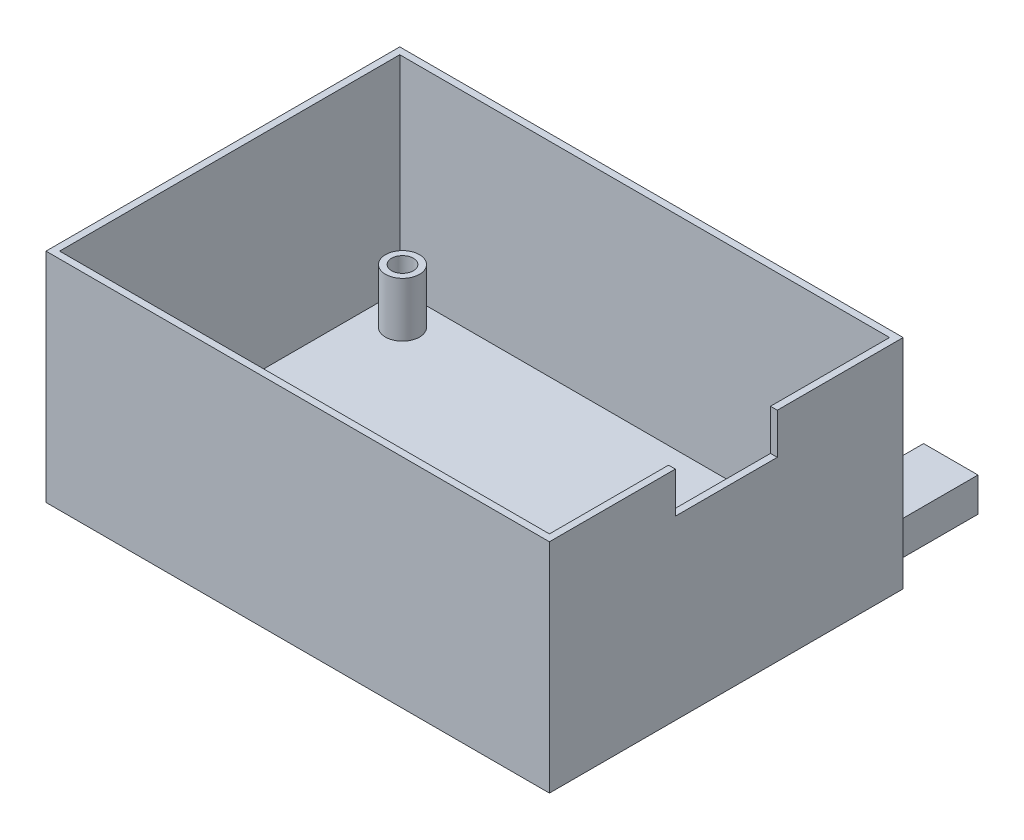
ISO-10303-21;
HEADER;
FILE_DESCRIPTION(('STEP AP214'),'2;1');
FILE_NAME('part.step','',(''),(''),'','','');
FILE_SCHEMA(('AUTOMOTIVE_DESIGN { 1 0 10303 214 1 1 1 1 }'));
ENDSEC;
DATA;
#1=APPLICATION_CONTEXT('core data for automotive mechanical design processes');
#2=APPLICATION_PROTOCOL_DEFINITION('international standard','automotive_design',2000,#1);
#3=PRODUCT_CONTEXT('',#1,'mechanical');
#4=PRODUCT('Part','Part','',(#3));
#5=PRODUCT_RELATED_PRODUCT_CATEGORY('part','',(#4));
#6=PRODUCT_DEFINITION_FORMATION('','',#4);
#7=PRODUCT_DEFINITION_CONTEXT('part definition',#1,'design');
#8=PRODUCT_DEFINITION('design','',#6,#7);
#9=PRODUCT_DEFINITION_SHAPE('','',#8);
#10=(LENGTH_UNIT() NAMED_UNIT(*) SI_UNIT(.MILLI.,.METRE.));
#11=(NAMED_UNIT(*) PLANE_ANGLE_UNIT() SI_UNIT($,.RADIAN.));
#12=(NAMED_UNIT(*) SI_UNIT($,.STERADIAN.) SOLID_ANGLE_UNIT());
#13=UNCERTAINTY_MEASURE_WITH_UNIT(LENGTH_MEASURE(1.E-05),#10,'distance_accuracy_value','');
#14=(GEOMETRIC_REPRESENTATION_CONTEXT(3) GLOBAL_UNCERTAINTY_ASSIGNED_CONTEXT((#13)) GLOBAL_UNIT_ASSIGNED_CONTEXT((#10,
#11,#12)) REPRESENTATION_CONTEXT('',''));
#15=CARTESIAN_POINT('',(0.,0.,0.));
#16=DIRECTION('',(0.,0.,1.));
#17=DIRECTION('',(1.,0.,0.));
#18=AXIS2_PLACEMENT_3D('',#15,#16,#17);
#19=CARTESIAN_POINT('',(37.,32.,-26.));
#20=DIRECTION('',(0.,0.,1.));
#21=DIRECTION('',(1.,0.,0.));
#22=AXIS2_PLACEMENT_3D('',#19,#20,#21);
#23=PLANE('',#22);
#24=DIRECTION('',(0.,1.,0.));
#25=VECTOR('',#24,1.);
#26=CARTESIAN_POINT('',(-33.,5.,-26.));
#27=LINE('',#26,#25);
#28=CARTESIAN_POINT('',(-33.,0.,-26.));
#29=VERTEX_POINT('',#28);
#30=CARTESIAN_POINT('',(-33.,5.,-26.));
#31=VERTEX_POINT('',#30);
#32=EDGE_CURVE('E223',#29,#31,#27,.T.);
#33=ORIENTED_EDGE('',*,*,#32,.F.);
#34=DIRECTION('',(-1.,0.,0.));
#35=VECTOR('',#34,1.);
#36=CARTESIAN_POINT('',(37.,0.,-26.));
#37=LINE('',#36,#35);
#38=CARTESIAN_POINT('',(-37.,0.,-26.));
#39=VERTEX_POINT('',#38);
#40=EDGE_CURVE('E490',#29,#39,#37,.T.);
#41=ORIENTED_EDGE('',*,*,#40,.T.);
#42=DIRECTION('',(0.,-1.,0.));
#43=VECTOR('',#42,1.);
#44=CARTESIAN_POINT('',(-37.,32.,-26.));
#45=LINE('',#44,#43);
#46=CARTESIAN_POINT('',(-37.,32.,-26.));
#47=VERTEX_POINT('',#46);
#48=EDGE_CURVE('E480',#47,#39,#45,.T.);
#49=ORIENTED_EDGE('',*,*,#48,.F.);
#50=DIRECTION('',(-1.,0.,0.));
#51=VECTOR('',#50,1.);
#52=CARTESIAN_POINT('',(37.,32.,-26.));
#53=LINE('',#52,#51);
#54=CARTESIAN_POINT('',(37.,32.,-26.));
#55=VERTEX_POINT('',#54);
#56=EDGE_CURVE('E477',#55,#47,#53,.T.);
#57=ORIENTED_EDGE('',*,*,#56,.F.);
#58=DIRECTION('',(0.,-1.,0.));
#59=VECTOR('',#58,1.);
#60=CARTESIAN_POINT('',(37.,32.,-26.));
#61=LINE('',#60,#59);
#62=CARTESIAN_POINT('',(37.,0.,-26.));
#63=VERTEX_POINT('',#62);
#64=EDGE_CURVE('E497',#55,#63,#61,.T.);
#65=ORIENTED_EDGE('',*,*,#64,.T.);
#66=CARTESIAN_POINT('',(33.,0.,-26.));
#67=VERTEX_POINT('',#66);
#68=EDGE_CURVE('E469',#63,#67,#37,.T.);
#69=ORIENTED_EDGE('',*,*,#68,.T.);
#70=DIRECTION('',(0.,-1.,0.));
#71=VECTOR('',#70,1.);
#72=CARTESIAN_POINT('',(33.,5.,-26.));
#73=LINE('',#72,#71);
#74=CARTESIAN_POINT('',(33.,5.,-26.));
#75=VERTEX_POINT('',#74);
#76=EDGE_CURVE('E241',#75,#67,#73,.T.);
#77=ORIENTED_EDGE('',*,*,#76,.F.);
#78=DIRECTION('',(1.,0.,0.));
#79=VECTOR('',#78,1.);
#80=CARTESIAN_POINT('',(33.,5.,-26.));
#81=LINE('',#80,#79);
#82=CARTESIAN_POINT('',(25.,5.,-26.));
#83=VERTEX_POINT('',#82);
#84=EDGE_CURVE('E230',#83,#75,#81,.T.);
#85=ORIENTED_EDGE('',*,*,#84,.F.);
#86=DIRECTION('',(0.,1.,0.));
#87=VECTOR('',#86,1.);
#88=CARTESIAN_POINT('',(25.,5.,-26.));
#89=LINE('',#88,#87);
#90=CARTESIAN_POINT('',(25.,0.,-26.));
#91=VERTEX_POINT('',#90);
#92=EDGE_CURVE('E225',#91,#83,#89,.T.);
#93=ORIENTED_EDGE('',*,*,#92,.F.);
#94=CARTESIAN_POINT('',(-25.,0.,-26.));
#95=VERTEX_POINT('',#94);
#96=EDGE_CURVE('E493',#91,#95,#37,.T.);
#97=ORIENTED_EDGE('',*,*,#96,.T.);
#98=DIRECTION('',(0.,-1.,0.));
#99=VECTOR('',#98,1.);
#100=CARTESIAN_POINT('',(-25.,5.,-26.));
#101=LINE('',#100,#99);
#102=CARTESIAN_POINT('',(-25.,5.,-26.));
#103=VERTEX_POINT('',#102);
#104=EDGE_CURVE('E60',#103,#95,#101,.T.);
#105=ORIENTED_EDGE('',*,*,#104,.F.);
#106=DIRECTION('',(1.,0.,0.));
#107=VECTOR('',#106,1.);
#108=CARTESIAN_POINT('',(-25.,5.,-26.));
#109=LINE('',#108,#107);
#110=EDGE_CURVE('E55',#31,#103,#109,.T.);
#111=ORIENTED_EDGE('',*,*,#110,.F.);
#112=EDGE_LOOP('',(#33,#41,#49,#57,#65,#69,#77,#85,#93,#97,#105,#111));
#113=FACE_BOUND('',#112,.T.);
#114=ADVANCED_FACE('F39',(#113),#23,.F.);
#115=CARTESIAN_POINT('',(-37.,32.,-26.));
#116=DIRECTION('',(1.,0.,0.));
#117=DIRECTION('',(0.,0.,-1.));
#118=AXIS2_PLACEMENT_3D('',#115,#116,#117);
#119=PLANE('',#118);
#120=DIRECTION('',(0.,0.,1.));
#121=VECTOR('',#120,1.);
#122=CARTESIAN_POINT('',(-37.,0.,-26.));
#123=LINE('',#122,#121);
#124=CARTESIAN_POINT('',(-37.,0.,26.));
#125=VERTEX_POINT('',#124);
#126=EDGE_CURVE('E454',#39,#125,#123,.T.);
#127=ORIENTED_EDGE('',*,*,#126,.T.);
#128=DIRECTION('',(0.,-1.,0.));
#129=VECTOR('',#128,1.);
#130=CARTESIAN_POINT('',(-37.,32.,26.));
#131=LINE('',#130,#129);
#132=CARTESIAN_POINT('',(-37.,32.,26.));
#133=VERTEX_POINT('',#132);
#134=EDGE_CURVE('E11',#133,#125,#131,.T.);
#135=ORIENTED_EDGE('',*,*,#134,.F.);
#136=DIRECTION('',(0.,0.,1.));
#137=VECTOR('',#136,1.);
#138=CARTESIAN_POINT('',(-37.,32.,-26.));
#139=LINE('',#138,#137);
#140=EDGE_CURVE('E464',#47,#133,#139,.T.);
#141=ORIENTED_EDGE('',*,*,#140,.F.);
#142=ORIENTED_EDGE('',*,*,#48,.T.);
#143=EDGE_LOOP('',(#127,#135,#141,#142));
#144=FACE_BOUND('',#143,.T.);
#145=ADVANCED_FACE('F41',(#144),#119,.F.);
#146=CARTESIAN_POINT('',(37.,32.,26.));
#147=DIRECTION('',(0.,0.,-1.));
#148=DIRECTION('',(-1.,0.,0.));
#149=AXIS2_PLACEMENT_3D('',#146,#147,#148);
#150=PLANE('',#149);
#151=DIRECTION('',(1.,0.,0.));
#152=VECTOR('',#151,1.);
#153=CARTESIAN_POINT('',(37.,0.,26.));
#154=LINE('',#153,#152);
#155=CARTESIAN_POINT('',(37.,0.,26.));
#156=VERTEX_POINT('',#155);
#157=EDGE_CURVE('E484',#125,#156,#154,.T.);
#158=ORIENTED_EDGE('',*,*,#157,.T.);
#159=DIRECTION('',(0.,-1.,0.));
#160=VECTOR('',#159,1.);
#161=CARTESIAN_POINT('',(37.,32.,26.));
#162=LINE('',#161,#160);
#163=CARTESIAN_POINT('',(37.,32.,26.));
#164=VERTEX_POINT('',#163);
#165=EDGE_CURVE('E48',#164,#156,#162,.T.);
#166=ORIENTED_EDGE('',*,*,#165,.F.);
#167=DIRECTION('',(1.,0.,0.));
#168=VECTOR('',#167,1.);
#169=CARTESIAN_POINT('',(37.,32.,26.));
#170=LINE('',#169,#168);
#171=EDGE_CURVE('E468',#133,#164,#170,.T.);
#172=ORIENTED_EDGE('',*,*,#171,.F.);
#173=ORIENTED_EDGE('',*,*,#134,.T.);
#174=EDGE_LOOP('',(#158,#166,#172,#173));
#175=FACE_BOUND('',#174,.T.);
#176=ADVANCED_FACE('F546',(#175),#150,.F.);
#177=CARTESIAN_POINT('',(37.,32.,-26.));
#178=DIRECTION('',(-1.,0.,0.));
#179=DIRECTION('',(0.,0.,1.));
#180=AXIS2_PLACEMENT_3D('',#177,#178,#179);
#181=PLANE('',#180);
#182=DIRECTION('',(0.,0.,1.));
#183=VECTOR('',#182,1.);
#184=CARTESIAN_POINT('',(37.,26.,-26.));
#185=LINE('',#184,#183);
#186=CARTESIAN_POINT('',(37.,26.,-7.5));
#187=VERTEX_POINT('',#186);
#188=CARTESIAN_POINT('',(37.,26.,7.49252757893605));
#189=VERTEX_POINT('',#188);
#190=EDGE_CURVE('E345',#187,#189,#185,.T.);
#191=ORIENTED_EDGE('',*,*,#190,.T.);
#192=DIRECTION('',(0.,1.,0.));
#193=VECTOR('',#192,1.);
#194=CARTESIAN_POINT('',(37.,32.,7.49252757893605));
#195=LINE('',#194,#193);
#196=CARTESIAN_POINT('',(37.,32.,7.49252757893605));
#197=VERTEX_POINT('',#196);
#198=EDGE_CURVE('E349',#189,#197,#195,.T.);
#199=ORIENTED_EDGE('',*,*,#198,.T.);
#200=DIRECTION('',(0.,0.,-1.));
#201=VECTOR('',#200,1.);
#202=CARTESIAN_POINT('',(37.,32.,-26.));
#203=LINE('',#202,#201);
#204=EDGE_CURVE('E473',#164,#197,#203,.T.);
#205=ORIENTED_EDGE('',*,*,#204,.F.);
#206=ORIENTED_EDGE('',*,*,#165,.T.);
#207=DIRECTION('',(0.,0.,-1.));
#208=VECTOR('',#207,1.);
#209=CARTESIAN_POINT('',(37.,0.,-26.));
#210=LINE('',#209,#208);
#211=EDGE_CURVE('E487',#156,#63,#210,.T.);
#212=ORIENTED_EDGE('',*,*,#211,.T.);
#213=ORIENTED_EDGE('',*,*,#64,.F.);
#214=CARTESIAN_POINT('',(37.,32.,-7.5));
#215=VERTEX_POINT('',#214);
#216=EDGE_CURVE('E472',#215,#55,#203,.T.);
#217=ORIENTED_EDGE('',*,*,#216,.F.);
#218=DIRECTION('',(0.,-1.,0.));
#219=VECTOR('',#218,1.);
#220=CARTESIAN_POINT('',(37.,32.,-7.5));
#221=LINE('',#220,#219);
#222=EDGE_CURVE('E333',#215,#187,#221,.T.);
#223=ORIENTED_EDGE('',*,*,#222,.T.);
#224=EDGE_LOOP('',(#191,#199,#205,#206,#212,#213,#217,#223));
#225=FACE_BOUND('',#224,.T.);
#226=ADVANCED_FACE('F506',(#225),#181,.F.);
#227=CARTESIAN_POINT('',(0.,32.,0.));
#228=DIRECTION('',(0.,-1.,0.));
#229=DIRECTION('',(0.,0.,-1.));
#230=AXIS2_PLACEMENT_3D('',#227,#228,#229);
#231=PLANE('',#230);
#232=ORIENTED_EDGE('',*,*,#204,.T.);
#233=DIRECTION('',(-1.,0.,0.));
#234=VECTOR('',#233,1.);
#235=CARTESIAN_POINT('',(37.000012,32.,7.49252757893605));
#236=LINE('',#235,#234);
#237=CARTESIAN_POINT('',(36.,32.,7.49252757893605));
#238=VERTEX_POINT('',#237);
#239=EDGE_CURVE('E329',#197,#238,#236,.T.);
#240=ORIENTED_EDGE('',*,*,#239,.T.);
#241=DIRECTION('',(0.,0.,-1.));
#242=VECTOR('',#241,1.);
#243=CARTESIAN_POINT('',(36.,32.,-25.));
#244=LINE('',#243,#242);
#245=CARTESIAN_POINT('',(36.,32.,25.));
#246=VERTEX_POINT('',#245);
#247=EDGE_CURVE('E436',#246,#238,#244,.T.);
#248=ORIENTED_EDGE('',*,*,#247,.F.);
#249=DIRECTION('',(1.,0.,0.));
#250=VECTOR('',#249,1.);
#251=CARTESIAN_POINT('',(-36.,32.,25.));
#252=LINE('',#251,#250);
#253=CARTESIAN_POINT('',(-36.,32.,25.));
#254=VERTEX_POINT('',#253);
#255=EDGE_CURVE('E423',#254,#246,#252,.T.);
#256=ORIENTED_EDGE('',*,*,#255,.F.);
#257=DIRECTION('',(0.,0.,1.));
#258=VECTOR('',#257,1.);
#259=CARTESIAN_POINT('',(-36.,32.,-25.));
#260=LINE('',#259,#258);
#261=CARTESIAN_POINT('',(-36.,32.,-25.));
#262=VERTEX_POINT('',#261);
#263=EDGE_CURVE('E444',#262,#254,#260,.T.);
#264=ORIENTED_EDGE('',*,*,#263,.F.);
#265=DIRECTION('',(-1.,0.,0.));
#266=VECTOR('',#265,1.);
#267=CARTESIAN_POINT('',(-36.,32.,-25.));
#268=LINE('',#267,#266);
#269=CARTESIAN_POINT('',(36.,32.,-25.));
#270=VERTEX_POINT('',#269);
#271=EDGE_CURVE('E440',#270,#262,#268,.T.);
#272=ORIENTED_EDGE('',*,*,#271,.F.);
#273=CARTESIAN_POINT('',(36.,32.,-7.5));
#274=VERTEX_POINT('',#273);
#275=EDGE_CURVE('E414',#274,#270,#244,.T.);
#276=ORIENTED_EDGE('',*,*,#275,.F.);
#277=DIRECTION('',(-1.,0.,0.));
#278=VECTOR('',#277,1.);
#279=CARTESIAN_POINT('',(37.000012,32.,-7.5));
#280=LINE('',#279,#278);
#281=EDGE_CURVE('E328',#215,#274,#280,.T.);
#282=ORIENTED_EDGE('',*,*,#281,.F.);
#283=ORIENTED_EDGE('',*,*,#216,.T.);
#284=ORIENTED_EDGE('',*,*,#56,.T.);
#285=ORIENTED_EDGE('',*,*,#140,.T.);
#286=ORIENTED_EDGE('',*,*,#171,.T.);
#287=EDGE_LOOP('',(#232,#240,#248,#256,#264,#272,#276,#282,#283,#284,#285,#286));
#288=FACE_BOUND('',#287,.T.);
#289=ADVANCED_FACE('F552',(#288),#231,.F.);
#290=CARTESIAN_POINT('',(0.,0.,0.));
#291=DIRECTION('',(0.,-1.,0.));
#292=DIRECTION('',(0.,0.,-1.));
#293=AXIS2_PLACEMENT_3D('',#290,#291,#292);
#294=PLANE('',#293);
#295=DIRECTION('',(0.,0.,-1.));
#296=VECTOR('',#295,1.);
#297=CARTESIAN_POINT('',(-13.,0.,11.));
#298=LINE('',#297,#296);
#299=CARTESIAN_POINT('',(-13.,0.,15.));
#300=VERTEX_POINT('',#299);
#301=CARTESIAN_POINT('',(-13.,0.,11.));
#302=VERTEX_POINT('',#301);
#303=EDGE_CURVE('E273',#300,#302,#298,.T.);
#304=ORIENTED_EDGE('',*,*,#303,.T.);
#305=DIRECTION('',(-1.,0.,0.));
#306=VECTOR('',#305,1.);
#307=CARTESIAN_POINT('',(-21.,0.,11.));
#308=LINE('',#307,#306);
#309=CARTESIAN_POINT('',(-21.,0.,11.));
#310=VERTEX_POINT('',#309);
#311=EDGE_CURVE('E277',#302,#310,#308,.T.);
#312=ORIENTED_EDGE('',*,*,#311,.T.);
#313=DIRECTION('',(0.,0.,1.));
#314=VECTOR('',#313,1.);
#315=CARTESIAN_POINT('',(-21.,0.,11.));
#316=LINE('',#315,#314);
#317=CARTESIAN_POINT('',(-21.,0.,15.));
#318=VERTEX_POINT('',#317);
#319=EDGE_CURVE('E282',#310,#318,#316,.T.);
#320=ORIENTED_EDGE('',*,*,#319,.T.);
#321=DIRECTION('',(1.,0.,0.));
#322=VECTOR('',#321,1.);
#323=CARTESIAN_POINT('',(-21.,0.,15.));
#324=LINE('',#323,#322);
#325=EDGE_CURVE('E286',#318,#300,#324,.T.);
#326=ORIENTED_EDGE('',*,*,#325,.T.);
#327=EDGE_LOOP('',(#304,#312,#320,#326));
#328=FACE_BOUND('',#327,.T.);
#329=ORIENTED_EDGE('',*,*,#126,.F.);
#330=ORIENTED_EDGE('',*,*,#40,.F.);
#331=DIRECTION('',(0.,0.,1.));
#332=VECTOR('',#331,1.);
#333=CARTESIAN_POINT('',(-33.,0.,-41.));
#334=LINE('',#333,#332);
#335=CARTESIAN_POINT('',(-33.,0.,-41.));
#336=VERTEX_POINT('',#335);
#337=EDGE_CURVE('E559',#336,#29,#334,.T.);
#338=ORIENTED_EDGE('',*,*,#337,.F.);
#339=DIRECTION('',(-1.,0.,0.));
#340=VECTOR('',#339,1.);
#341=CARTESIAN_POINT('',(-25.,0.,-41.));
#342=LINE('',#341,#340);
#343=CARTESIAN_POINT('',(-25.,0.,-41.));
#344=VERTEX_POINT('',#343);
#345=EDGE_CURVE('E216',#344,#336,#342,.T.);
#346=ORIENTED_EDGE('',*,*,#345,.F.);
#347=DIRECTION('',(0.,0.,1.));
#348=VECTOR('',#347,1.);
#349=CARTESIAN_POINT('',(-25.,0.,-41.));
#350=LINE('',#349,#348);
#351=EDGE_CURVE('E232',#344,#95,#350,.T.);
#352=ORIENTED_EDGE('',*,*,#351,.T.);
#353=ORIENTED_EDGE('',*,*,#96,.F.);
#354=DIRECTION('',(0.,0.,1.));
#355=VECTOR('',#354,1.);
#356=CARTESIAN_POINT('',(25.,0.,-41.));
#357=LINE('',#356,#355);
#358=CARTESIAN_POINT('',(25.,0.,-41.));
#359=VERTEX_POINT('',#358);
#360=EDGE_CURVE('E249',#359,#91,#357,.T.);
#361=ORIENTED_EDGE('',*,*,#360,.F.);
#362=DIRECTION('',(-1.,0.,0.));
#363=VECTOR('',#362,1.);
#364=CARTESIAN_POINT('',(33.,0.,-41.));
#365=LINE('',#364,#363);
#366=CARTESIAN_POINT('',(33.,0.,-41.));
#367=VERTEX_POINT('',#366);
#368=EDGE_CURVE('E247',#367,#359,#365,.T.);
#369=ORIENTED_EDGE('',*,*,#368,.F.);
#370=DIRECTION('',(0.,0.,1.));
#371=VECTOR('',#370,1.);
#372=CARTESIAN_POINT('',(33.,0.,-41.));
#373=LINE('',#372,#371);
#374=EDGE_CURVE('E260',#367,#67,#373,.T.);
#375=ORIENTED_EDGE('',*,*,#374,.T.);
#376=ORIENTED_EDGE('',*,*,#68,.F.);
#377=ORIENTED_EDGE('',*,*,#211,.F.);
#378=ORIENTED_EDGE('',*,*,#157,.F.);
#379=EDGE_LOOP('',(#329,#330,#338,#346,#352,#353,#361,#369,#375,#376,#377,#378));
#380=FACE_BOUND('',#379,.T.);
#381=ADVANCED_FACE('F512',(#328,#380),#294,.T.);
#382=CARTESIAN_POINT('',(36.,2.,-25.));
#383=DIRECTION('',(1.,0.,0.));
#384=DIRECTION('',(0.,0.,-1.));
#385=AXIS2_PLACEMENT_3D('',#382,#383,#384);
#386=PLANE('',#385);
#387=ORIENTED_EDGE('',*,*,#247,.T.);
#388=DIRECTION('',(0.,-1.,0.));
#389=VECTOR('',#388,1.);
#390=CARTESIAN_POINT('',(36.,32.,7.49252757893605));
#391=LINE('',#390,#389);
#392=CARTESIAN_POINT('',(36.,26.,7.49252757893605));
#393=VERTEX_POINT('',#392);
#394=EDGE_CURVE('E324',#238,#393,#391,.T.);
#395=ORIENTED_EDGE('',*,*,#394,.T.);
#396=DIRECTION('',(0.,0.,-1.));
#397=VECTOR('',#396,1.);
#398=CARTESIAN_POINT('',(36.,26.,7.49252757893603));
#399=LINE('',#398,#397);
#400=CARTESIAN_POINT('',(36.,26.,-7.50000000000001));
#401=VERTEX_POINT('',#400);
#402=EDGE_CURVE('E320',#393,#401,#399,.T.);
#403=ORIENTED_EDGE('',*,*,#402,.T.);
#404=DIRECTION('',(0.,1.,0.));
#405=VECTOR('',#404,1.);
#406=CARTESIAN_POINT('',(36.,26.,-7.5));
#407=LINE('',#406,#405);
#408=EDGE_CURVE('E307',#401,#274,#407,.T.);
#409=ORIENTED_EDGE('',*,*,#408,.T.);
#410=ORIENTED_EDGE('',*,*,#275,.T.);
#411=DIRECTION('',(0.,1.,0.));
#412=VECTOR('',#411,1.);
#413=CARTESIAN_POINT('',(36.,2.,-25.));
#414=LINE('',#413,#412);
#415=CARTESIAN_POINT('',(36.,2.,-25.));
#416=VERTEX_POINT('',#415);
#417=EDGE_CURVE('E435',#416,#270,#414,.T.);
#418=ORIENTED_EDGE('',*,*,#417,.F.);
#419=DIRECTION('',(0.,0.,-1.));
#420=VECTOR('',#419,1.);
#421=CARTESIAN_POINT('',(36.,2.,-25.));
#422=LINE('',#421,#420);
#423=CARTESIAN_POINT('',(36.,2.,25.));
#424=VERTEX_POINT('',#423);
#425=EDGE_CURVE('E418',#424,#416,#422,.T.);
#426=ORIENTED_EDGE('',*,*,#425,.F.);
#427=DIRECTION('',(0.,1.,0.));
#428=VECTOR('',#427,1.);
#429=CARTESIAN_POINT('',(36.,2.,25.));
#430=LINE('',#429,#428);
#431=EDGE_CURVE('E451',#424,#246,#430,.T.);
#432=ORIENTED_EDGE('',*,*,#431,.T.);
#433=EDGE_LOOP('',(#387,#395,#403,#409,#410,#418,#426,#432));
#434=FACE_BOUND('',#433,.T.);
#435=ADVANCED_FACE('F626',(#434),#386,.F.);
#436=CARTESIAN_POINT('',(-36.,2.,25.));
#437=DIRECTION('',(0.,0.,1.));
#438=DIRECTION('',(1.,0.,0.));
#439=AXIS2_PLACEMENT_3D('',#436,#437,#438);
#440=PLANE('',#439);
#441=ORIENTED_EDGE('',*,*,#255,.T.);
#442=ORIENTED_EDGE('',*,*,#431,.F.);
#443=DIRECTION('',(1.,0.,0.));
#444=VECTOR('',#443,1.);
#445=CARTESIAN_POINT('',(-36.,2.,25.));
#446=LINE('',#445,#444);
#447=CARTESIAN_POINT('',(-36.,2.,25.));
#448=VERTEX_POINT('',#447);
#449=EDGE_CURVE('E431',#448,#424,#446,.T.);
#450=ORIENTED_EDGE('',*,*,#449,.F.);
#451=DIRECTION('',(0.,1.,0.));
#452=VECTOR('',#451,1.);
#453=CARTESIAN_POINT('',(-36.,2.,25.));
#454=LINE('',#453,#452);
#455=EDGE_CURVE('E455',#448,#254,#454,.T.);
#456=ORIENTED_EDGE('',*,*,#455,.T.);
#457=EDGE_LOOP('',(#441,#442,#450,#456));
#458=FACE_BOUND('',#457,.T.);
#459=ADVANCED_FACE('F729',(#458),#440,.F.);
#460=CARTESIAN_POINT('',(-36.,2.,-25.));
#461=DIRECTION('',(-1.,0.,0.));
#462=DIRECTION('',(0.,0.,1.));
#463=AXIS2_PLACEMENT_3D('',#460,#461,#462);
#464=PLANE('',#463);
#465=ORIENTED_EDGE('',*,*,#263,.T.);
#466=ORIENTED_EDGE('',*,*,#455,.F.);
#467=DIRECTION('',(0.,0.,1.));
#468=VECTOR('',#467,1.);
#469=CARTESIAN_POINT('',(-36.,2.,-25.));
#470=LINE('',#469,#468);
#471=CARTESIAN_POINT('',(-36.,2.,-25.));
#472=VERTEX_POINT('',#471);
#473=EDGE_CURVE('E427',#472,#448,#470,.T.);
#474=ORIENTED_EDGE('',*,*,#473,.F.);
#475=DIRECTION('',(0.,1.,0.));
#476=VECTOR('',#475,1.);
#477=CARTESIAN_POINT('',(-36.,2.,-25.));
#478=LINE('',#477,#476);
#479=EDGE_CURVE('E458',#472,#262,#478,.T.);
#480=ORIENTED_EDGE('',*,*,#479,.T.);
#481=EDGE_LOOP('',(#465,#466,#474,#480));
#482=FACE_BOUND('',#481,.T.);
#483=ADVANCED_FACE('F908',(#482),#464,.F.);
#484=CARTESIAN_POINT('',(-36.,2.,-25.));
#485=DIRECTION('',(0.,0.,-1.));
#486=DIRECTION('',(-1.,0.,0.));
#487=AXIS2_PLACEMENT_3D('',#484,#485,#486);
#488=PLANE('',#487);
#489=ORIENTED_EDGE('',*,*,#271,.T.);
#490=ORIENTED_EDGE('',*,*,#479,.F.);
#491=DIRECTION('',(-1.,0.,0.));
#492=VECTOR('',#491,1.);
#493=CARTESIAN_POINT('',(-36.,2.,-25.));
#494=LINE('',#493,#492);
#495=EDGE_CURVE('E422',#416,#472,#494,.T.);
#496=ORIENTED_EDGE('',*,*,#495,.F.);
#497=ORIENTED_EDGE('',*,*,#417,.T.);
#498=EDGE_LOOP('',(#489,#490,#496,#497));
#499=FACE_BOUND('',#498,.T.);
#500=ADVANCED_FACE('F686',(#499),#488,.F.);
#501=CARTESIAN_POINT('',(0.,2.,0.));
#502=DIRECTION('',(0.,1.,0.));
#503=DIRECTION('',(0.,0.,1.));
#504=AXIS2_PLACEMENT_3D('',#501,#502,#503);
#505=PLANE('',#504);
#506=DIRECTION('',(0.,0.,-1.));
#507=VECTOR('',#506,1.);
#508=CARTESIAN_POINT('',(-13.,2.,11.));
#509=LINE('',#508,#507);
#510=CARTESIAN_POINT('',(-13.,2.,15.));
#511=VERTEX_POINT('',#510);
#512=CARTESIAN_POINT('',(-13.,2.,11.));
#513=VERTEX_POINT('',#512);
#514=EDGE_CURVE('E272',#511,#513,#509,.T.);
#515=ORIENTED_EDGE('',*,*,#514,.F.);
#516=DIRECTION('',(1.,0.,0.));
#517=VECTOR('',#516,1.);
#518=CARTESIAN_POINT('',(-21.,2.,15.));
#519=LINE('',#518,#517);
#520=CARTESIAN_POINT('',(-21.,2.,15.));
#521=VERTEX_POINT('',#520);
#522=EDGE_CURVE('E278',#521,#511,#519,.T.);
#523=ORIENTED_EDGE('',*,*,#522,.F.);
#524=DIRECTION('',(0.,0.,1.));
#525=VECTOR('',#524,1.);
#526=CARTESIAN_POINT('',(-21.,2.,11.));
#527=LINE('',#526,#525);
#528=CARTESIAN_POINT('',(-21.,2.,11.));
#529=VERTEX_POINT('',#528);
#530=EDGE_CURVE('E297',#529,#521,#527,.T.);
#531=ORIENTED_EDGE('',*,*,#530,.F.);
#532=DIRECTION('',(-1.,0.,0.));
#533=VECTOR('',#532,1.);
#534=CARTESIAN_POINT('',(-21.,2.,11.));
#535=LINE('',#534,#533);
#536=EDGE_CURVE('E293',#513,#529,#535,.T.);
#537=ORIENTED_EDGE('',*,*,#536,.F.);
#538=EDGE_LOOP('',(#515,#523,#531,#537));
#539=FACE_BOUND('',#538,.T.);
#540=CARTESIAN_POINT('',(31.1,2.,20.5));
#541=DIRECTION('',(0.,1.,0.));
#542=DIRECTION('',(0.,0.,1.));
#543=AXIS2_PLACEMENT_3D('',#540,#541,#542);
#544=CIRCLE('',#543,2.49999999999999);
#545=CARTESIAN_POINT('',(31.1,2.,23.));
#546=VERTEX_POINT('',#545);
#547=EDGE_CURVE('E382',#546,#546,#544,.T.);
#548=ORIENTED_EDGE('',*,*,#547,.F.);
#549=EDGE_LOOP('',(#548));
#550=FACE_BOUND('',#549,.T.);
#551=CARTESIAN_POINT('',(31.1,2.,-20.5));
#552=DIRECTION('',(0.,1.,0.));
#553=DIRECTION('',(0.,0.,1.));
#554=AXIS2_PLACEMENT_3D('',#551,#552,#553);
#555=CIRCLE('',#554,2.5);
#556=CARTESIAN_POINT('',(31.1,2.,-18.));
#557=VERTEX_POINT('',#556);
#558=EDGE_CURVE('E390',#557,#557,#555,.T.);
#559=ORIENTED_EDGE('',*,*,#558,.F.);
#560=EDGE_LOOP('',(#559));
#561=FACE_BOUND('',#560,.T.);
#562=CARTESIAN_POINT('',(-31.096,2.,20.5));
#563=DIRECTION('',(0.,1.,0.));
#564=DIRECTION('',(0.,0.,1.));
#565=AXIS2_PLACEMENT_3D('',#562,#563,#564);
#566=CIRCLE('',#565,2.5);
#567=CARTESIAN_POINT('',(-31.096,2.,23.));
#568=VERTEX_POINT('',#567);
#569=EDGE_CURVE('E398',#568,#568,#566,.T.);
#570=ORIENTED_EDGE('',*,*,#569,.F.);
#571=EDGE_LOOP('',(#570));
#572=FACE_BOUND('',#571,.T.);
#573=CARTESIAN_POINT('',(-31.096,2.,-20.5));
#574=DIRECTION('',(0.,1.,0.));
#575=DIRECTION('',(0.,0.,1.));
#576=AXIS2_PLACEMENT_3D('',#573,#574,#575);
#577=CIRCLE('',#576,2.5);
#578=CARTESIAN_POINT('',(-31.096,2.,-18.));
#579=VERTEX_POINT('',#578);
#580=EDGE_CURVE('E406',#579,#579,#577,.T.);
#581=ORIENTED_EDGE('',*,*,#580,.F.);
#582=EDGE_LOOP('',(#581));
#583=FACE_BOUND('',#582,.T.);
#584=ORIENTED_EDGE('',*,*,#425,.T.);
#585=ORIENTED_EDGE('',*,*,#495,.T.);
#586=ORIENTED_EDGE('',*,*,#473,.T.);
#587=ORIENTED_EDGE('',*,*,#449,.T.);
#588=EDGE_LOOP('',(#584,#585,#586,#587));
#589=FACE_BOUND('',#588,.T.);
#590=ADVANCED_FACE('F680',(#539,#550,#561,#572,#583,#589),#505,.T.);
#591=CARTESIAN_POINT('',(-31.096,10.,-20.5));
#592=DIRECTION('',(0.,-1.,0.));
#593=DIRECTION('',(0.,0.,-1.));
#594=AXIS2_PLACEMENT_3D('',#591,#592,#593);
#595=CYLINDRICAL_SURFACE('',#594,2.5);
#596=CARTESIAN_POINT('',(-31.096,10.,-20.5));
#597=DIRECTION('',(0.,1.,0.));
#598=DIRECTION('',(0.,0.,1.));
#599=AXIS2_PLACEMENT_3D('',#596,#597,#598);
#600=CIRCLE('',#599,2.5);
#601=CARTESIAN_POINT('',(-31.096,10.,-18.));
#602=VERTEX_POINT('',#601);
#603=EDGE_CURVE('E410',#602,#602,#600,.T.);
#604=ORIENTED_EDGE('',*,*,#603,.F.);
#605=EDGE_LOOP('',(#604));
#606=FACE_BOUND('',#605,.T.);
#607=ORIENTED_EDGE('',*,*,#580,.T.);
#608=EDGE_LOOP('',(#607));
#609=FACE_BOUND('',#608,.T.);
#610=ADVANCED_FACE('F685',(#606,#609),#595,.T.);
#611=CARTESIAN_POINT('',(-31.096,10.,-20.5));
#612=DIRECTION('',(0.,1.,0.));
#613=DIRECTION('',(0.,0.,1.));
#614=AXIS2_PLACEMENT_3D('',#611,#612,#613);
#615=PLANE('',#614);
#616=CARTESIAN_POINT('',(-31.096,10.,-20.5));
#617=DIRECTION('',(0.,1.,0.));
#618=DIRECTION('',(0.,0.,1.));
#619=AXIS2_PLACEMENT_3D('',#616,#617,#618);
#620=CIRCLE('',#619,1.6);
#621=CARTESIAN_POINT('',(-31.096,10.,-18.9));
#622=VERTEX_POINT('',#621);
#623=EDGE_CURVE('E358',#622,#622,#620,.T.);
#624=ORIENTED_EDGE('',*,*,#623,.F.);
#625=EDGE_LOOP('',(#624));
#626=FACE_BOUND('',#625,.T.);
#627=ORIENTED_EDGE('',*,*,#603,.T.);
#628=EDGE_LOOP('',(#627));
#629=FACE_BOUND('',#628,.T.);
#630=ADVANCED_FACE('F868',(#626,#629),#615,.T.);
#631=CARTESIAN_POINT('',(-31.096,10.,20.5));
#632=DIRECTION('',(0.,-1.,0.));
#633=DIRECTION('',(0.,0.,-1.));
#634=AXIS2_PLACEMENT_3D('',#631,#632,#633);
#635=CYLINDRICAL_SURFACE('',#634,2.5);
#636=CARTESIAN_POINT('',(-31.096,10.,20.5));
#637=DIRECTION('',(0.,1.,0.));
#638=DIRECTION('',(0.,0.,1.));
#639=AXIS2_PLACEMENT_3D('',#636,#637,#638);
#640=CIRCLE('',#639,2.5);
#641=CARTESIAN_POINT('',(-31.096,10.,23.));
#642=VERTEX_POINT('',#641);
#643=EDGE_CURVE('E402',#642,#642,#640,.T.);
#644=ORIENTED_EDGE('',*,*,#643,.F.);
#645=EDGE_LOOP('',(#644));
#646=FACE_BOUND('',#645,.T.);
#647=ORIENTED_EDGE('',*,*,#569,.T.);
#648=EDGE_LOOP('',(#647));
#649=FACE_BOUND('',#648,.T.);
#650=ADVANCED_FACE('F860',(#646,#649),#635,.T.);
#651=CARTESIAN_POINT('',(-31.096,10.,20.5));
#652=DIRECTION('',(0.,1.,0.));
#653=DIRECTION('',(0.,0.,1.));
#654=AXIS2_PLACEMENT_3D('',#651,#652,#653);
#655=PLANE('',#654);
#656=CARTESIAN_POINT('',(-31.096,10.,20.5));
#657=DIRECTION('',(0.,1.,0.));
#658=DIRECTION('',(0.,0.,1.));
#659=AXIS2_PLACEMENT_3D('',#656,#657,#658);
#660=CIRCLE('',#659,1.6);
#661=CARTESIAN_POINT('',(-31.096,10.,22.1));
#662=VERTEX_POINT('',#661);
#663=EDGE_CURVE('E359',#662,#662,#660,.T.);
#664=ORIENTED_EDGE('',*,*,#663,.F.);
#665=EDGE_LOOP('',(#664));
#666=FACE_BOUND('',#665,.T.);
#667=ORIENTED_EDGE('',*,*,#643,.T.);
#668=EDGE_LOOP('',(#667));
#669=FACE_BOUND('',#668,.T.);
#670=ADVANCED_FACE('F855',(#666,#669),#655,.T.);
#671=CARTESIAN_POINT('',(31.1,10.,-20.5));
#672=DIRECTION('',(0.,-1.,0.));
#673=DIRECTION('',(0.,0.,-1.));
#674=AXIS2_PLACEMENT_3D('',#671,#672,#673);
#675=CYLINDRICAL_SURFACE('',#674,2.5);
#676=CARTESIAN_POINT('',(31.1,10.,-20.5));
#677=DIRECTION('',(0.,1.,0.));
#678=DIRECTION('',(0.,0.,1.));
#679=AXIS2_PLACEMENT_3D('',#676,#677,#678);
#680=CIRCLE('',#679,2.5);
#681=CARTESIAN_POINT('',(31.1,10.,-18.));
#682=VERTEX_POINT('',#681);
#683=EDGE_CURVE('E394',#682,#682,#680,.T.);
#684=ORIENTED_EDGE('',*,*,#683,.F.);
#685=EDGE_LOOP('',(#684));
#686=FACE_BOUND('',#685,.T.);
#687=ORIENTED_EDGE('',*,*,#558,.T.);
#688=EDGE_LOOP('',(#687));
#689=FACE_BOUND('',#688,.T.);
#690=ADVANCED_FACE('F847',(#686,#689),#675,.T.);
#691=CARTESIAN_POINT('',(31.1,10.,-20.5));
#692=DIRECTION('',(0.,1.,0.));
#693=DIRECTION('',(0.,0.,1.));
#694=AXIS2_PLACEMENT_3D('',#691,#692,#693);
#695=PLANE('',#694);
#696=CARTESIAN_POINT('',(31.1,10.,-20.5));
#697=DIRECTION('',(0.,1.,0.));
#698=DIRECTION('',(0.,0.,1.));
#699=AXIS2_PLACEMENT_3D('',#696,#697,#698);
#700=CIRCLE('',#699,1.6);
#701=CARTESIAN_POINT('',(31.1,10.,-18.9));
#702=VERTEX_POINT('',#701);
#703=EDGE_CURVE('E353',#702,#702,#700,.T.);
#704=ORIENTED_EDGE('',*,*,#703,.F.);
#705=EDGE_LOOP('',(#704));
#706=FACE_BOUND('',#705,.T.);
#707=ORIENTED_EDGE('',*,*,#683,.T.);
#708=EDGE_LOOP('',(#707));
#709=FACE_BOUND('',#708,.T.);
#710=ADVANCED_FACE('F842',(#706,#709),#695,.T.);
#711=CARTESIAN_POINT('',(31.1,10.,20.5));
#712=DIRECTION('',(0.,-1.,0.));
#713=DIRECTION('',(0.,0.,-1.));
#714=AXIS2_PLACEMENT_3D('',#711,#712,#713);
#715=CYLINDRICAL_SURFACE('',#714,2.49999999999999);
#716=CARTESIAN_POINT('',(31.1,10.,20.5));
#717=DIRECTION('',(0.,1.,0.));
#718=DIRECTION('',(0.,0.,1.));
#719=AXIS2_PLACEMENT_3D('',#716,#717,#718);
#720=CIRCLE('',#719,2.49999999999999);
#721=CARTESIAN_POINT('',(31.1,10.,23.));
#722=VERTEX_POINT('',#721);
#723=EDGE_CURVE('E386',#722,#722,#720,.T.);
#724=ORIENTED_EDGE('',*,*,#723,.F.);
#725=EDGE_LOOP('',(#724));
#726=FACE_BOUND('',#725,.T.);
#727=ORIENTED_EDGE('',*,*,#547,.T.);
#728=EDGE_LOOP('',(#727));
#729=FACE_BOUND('',#728,.T.);
#730=ADVANCED_FACE('F834',(#726,#729),#715,.T.);
#731=CARTESIAN_POINT('',(31.1,10.,20.5));
#732=DIRECTION('',(0.,1.,0.));
#733=DIRECTION('',(0.,0.,1.));
#734=AXIS2_PLACEMENT_3D('',#731,#732,#733);
#735=PLANE('',#734);
#736=CARTESIAN_POINT('',(31.1,10.,20.5));
#737=DIRECTION('',(0.,1.,0.));
#738=DIRECTION('',(0.,0.,1.));
#739=AXIS2_PLACEMENT_3D('',#736,#737,#738);
#740=CIRCLE('',#739,1.6);
#741=CARTESIAN_POINT('',(31.1,10.,22.1));
#742=VERTEX_POINT('',#741);
#743=EDGE_CURVE('E367',#742,#742,#740,.T.);
#744=ORIENTED_EDGE('',*,*,#743,.F.);
#745=EDGE_LOOP('',(#744));
#746=FACE_BOUND('',#745,.T.);
#747=ORIENTED_EDGE('',*,*,#723,.T.);
#748=EDGE_LOOP('',(#747));
#749=FACE_BOUND('',#748,.T.);
#750=ADVANCED_FACE('F824',(#746,#749),#735,.T.);
#751=CARTESIAN_POINT('',(31.1,2.,20.5));
#752=DIRECTION('',(0.,1.,0.));
#753=DIRECTION('',(0.,0.,1.));
#754=AXIS2_PLACEMENT_3D('',#751,#752,#753);
#755=CYLINDRICAL_SURFACE('',#754,1.6);
#756=CARTESIAN_POINT('',(31.1,2.,20.5));
#757=DIRECTION('',(0.,1.,0.));
#758=DIRECTION('',(0.,0.,1.));
#759=AXIS2_PLACEMENT_3D('',#756,#757,#758);
#760=CIRCLE('',#759,1.6);
#761=CARTESIAN_POINT('',(31.1,2.,22.1));
#762=VERTEX_POINT('',#761);
#763=EDGE_CURVE('E363',#762,#762,#760,.T.);
#764=ORIENTED_EDGE('',*,*,#763,.F.);
#765=EDGE_LOOP('',(#764));
#766=FACE_BOUND('',#765,.T.);
#767=ORIENTED_EDGE('',*,*,#743,.T.);
#768=EDGE_LOOP('',(#767));
#769=FACE_BOUND('',#768,.T.);
#770=ADVANCED_FACE('F814',(#766,#769),#755,.F.);
#771=CARTESIAN_POINT('',(31.1,2.,20.5));
#772=DIRECTION('',(0.,1.,0.));
#773=DIRECTION('',(0.,0.,1.));
#774=AXIS2_PLACEMENT_3D('',#771,#772,#773);
#775=PLANE('',#774);
#776=ORIENTED_EDGE('',*,*,#763,.T.);
#777=EDGE_LOOP('',(#776));
#778=FACE_BOUND('',#777,.T.);
#779=ADVANCED_FACE('F804',(#778),#775,.T.);
#780=CARTESIAN_POINT('',(31.1,2.,-20.5));
#781=DIRECTION('',(0.,1.,0.));
#782=DIRECTION('',(0.,0.,1.));
#783=AXIS2_PLACEMENT_3D('',#780,#781,#782);
#784=CYLINDRICAL_SURFACE('',#783,1.6);
#785=CARTESIAN_POINT('',(31.1,2.,-20.5));
#786=DIRECTION('',(0.,1.,0.));
#787=DIRECTION('',(0.,0.,1.));
#788=AXIS2_PLACEMENT_3D('',#785,#786,#787);
#789=CIRCLE('',#788,1.6);
#790=CARTESIAN_POINT('',(31.1,2.,-18.9));
#791=VERTEX_POINT('',#790);
#792=EDGE_CURVE('E371',#791,#791,#789,.T.);
#793=ORIENTED_EDGE('',*,*,#792,.F.);
#794=EDGE_LOOP('',(#793));
#795=FACE_BOUND('',#794,.T.);
#796=ORIENTED_EDGE('',*,*,#703,.T.);
#797=EDGE_LOOP('',(#796));
#798=FACE_BOUND('',#797,.T.);
#799=ADVANCED_FACE('F794',(#795,#798),#784,.F.);
#800=CARTESIAN_POINT('',(31.1,2.,-20.5));
#801=DIRECTION('',(0.,1.,0.));
#802=DIRECTION('',(0.,0.,1.));
#803=AXIS2_PLACEMENT_3D('',#800,#801,#802);
#804=PLANE('',#803);
#805=ORIENTED_EDGE('',*,*,#792,.T.);
#806=EDGE_LOOP('',(#805));
#807=FACE_BOUND('',#806,.T.);
#808=ADVANCED_FACE('F784',(#807),#804,.T.);
#809=CARTESIAN_POINT('',(-31.096,2.,20.5));
#810=DIRECTION('',(0.,1.,0.));
#811=DIRECTION('',(0.,0.,1.));
#812=AXIS2_PLACEMENT_3D('',#809,#810,#811);
#813=CYLINDRICAL_SURFACE('',#812,1.6);
#814=CARTESIAN_POINT('',(-31.096,2.,20.5));
#815=DIRECTION('',(0.,1.,0.));
#816=DIRECTION('',(0.,0.,1.));
#817=AXIS2_PLACEMENT_3D('',#814,#815,#816);
#818=CIRCLE('',#817,1.6);
#819=CARTESIAN_POINT('',(-31.096,2.,22.1));
#820=VERTEX_POINT('',#819);
#821=EDGE_CURVE('E354',#820,#820,#818,.T.);
#822=ORIENTED_EDGE('',*,*,#821,.F.);
#823=EDGE_LOOP('',(#822));
#824=FACE_BOUND('',#823,.T.);
#825=ORIENTED_EDGE('',*,*,#663,.T.);
#826=EDGE_LOOP('',(#825));
#827=FACE_BOUND('',#826,.T.);
#828=ADVANCED_FACE('F774',(#824,#827),#813,.F.);
#829=CARTESIAN_POINT('',(-31.096,2.,20.5));
#830=DIRECTION('',(0.,1.,0.));
#831=DIRECTION('',(0.,0.,1.));
#832=AXIS2_PLACEMENT_3D('',#829,#830,#831);
#833=PLANE('',#832);
#834=ORIENTED_EDGE('',*,*,#821,.T.);
#835=EDGE_LOOP('',(#834));
#836=FACE_BOUND('',#835,.T.);
#837=ADVANCED_FACE('F764',(#836),#833,.T.);
#838=CARTESIAN_POINT('',(-31.096,2.,-20.5));
#839=DIRECTION('',(0.,1.,0.));
#840=DIRECTION('',(0.,0.,1.));
#841=AXIS2_PLACEMENT_3D('',#838,#839,#840);
#842=CYLINDRICAL_SURFACE('',#841,1.6);
#843=CARTESIAN_POINT('',(-31.096,2.,-20.5));
#844=DIRECTION('',(0.,1.,0.));
#845=DIRECTION('',(0.,0.,1.));
#846=AXIS2_PLACEMENT_3D('',#843,#844,#845);
#847=CIRCLE('',#846,1.6);
#848=CARTESIAN_POINT('',(-31.096,2.,-18.9));
#849=VERTEX_POINT('',#848);
#850=EDGE_CURVE('E378',#849,#849,#847,.T.);
#851=ORIENTED_EDGE('',*,*,#850,.F.);
#852=EDGE_LOOP('',(#851));
#853=FACE_BOUND('',#852,.T.);
#854=ORIENTED_EDGE('',*,*,#623,.T.);
#855=EDGE_LOOP('',(#854));
#856=FACE_BOUND('',#855,.T.);
#857=ADVANCED_FACE('F754',(#853,#856),#842,.F.);
#858=CARTESIAN_POINT('',(-31.096,2.,-20.5));
#859=DIRECTION('',(0.,1.,0.));
#860=DIRECTION('',(0.,0.,1.));
#861=AXIS2_PLACEMENT_3D('',#858,#859,#860);
#862=PLANE('',#861);
#863=ORIENTED_EDGE('',*,*,#850,.T.);
#864=EDGE_LOOP('',(#863));
#865=FACE_BOUND('',#864,.T.);
#866=ADVANCED_FACE('F718',(#865),#862,.T.);
#867=CARTESIAN_POINT('',(37.000012,32.,7.49252757893605));
#868=DIRECTION('',(0.,0.,1.));
#869=DIRECTION('',(0.,-1.,0.));
#870=AXIS2_PLACEMENT_3D('',#867,#868,#869);
#871=PLANE('',#870);
#872=DIRECTION('',(-1.,0.,0.));
#873=VECTOR('',#872,1.);
#874=CARTESIAN_POINT('',(37.000012,26.,7.49252757893605));
#875=LINE('',#874,#873);
#876=EDGE_CURVE('E334',#189,#393,#875,.T.);
#877=ORIENTED_EDGE('',*,*,#876,.T.);
#878=ORIENTED_EDGE('',*,*,#394,.F.);
#879=ORIENTED_EDGE('',*,*,#239,.F.);
#880=ORIENTED_EDGE('',*,*,#198,.F.);
#881=EDGE_LOOP('',(#877,#878,#879,#880));
#882=FACE_BOUND('',#881,.T.);
#883=ADVANCED_FACE('F708',(#882),#871,.F.);
#884=CARTESIAN_POINT('',(37.000012,26.,7.49252757893605));
#885=DIRECTION('',(0.,-1.,0.));
#886=DIRECTION('',(0.,0.,-1.));
#887=AXIS2_PLACEMENT_3D('',#884,#885,#886);
#888=PLANE('',#887);
#889=DIRECTION('',(-1.,0.,0.));
#890=VECTOR('',#889,1.);
#891=CARTESIAN_POINT('',(37.000012,26.,-7.5));
#892=LINE('',#891,#890);
#893=EDGE_CURVE('E337',#187,#401,#892,.T.);
#894=ORIENTED_EDGE('',*,*,#893,.T.);
#895=ORIENTED_EDGE('',*,*,#402,.F.);
#896=ORIENTED_EDGE('',*,*,#876,.F.);
#897=ORIENTED_EDGE('',*,*,#190,.F.);
#898=EDGE_LOOP('',(#894,#895,#896,#897));
#899=FACE_BOUND('',#898,.T.);
#900=ADVANCED_FACE('F698',(#899),#888,.F.);
#901=CARTESIAN_POINT('',(37.000012,26.,-7.5));
#902=DIRECTION('',(0.,0.,-1.));
#903=DIRECTION('',(-1.,0.,0.));
#904=AXIS2_PLACEMENT_3D('',#901,#902,#903);
#905=PLANE('',#904);
#906=ORIENTED_EDGE('',*,*,#281,.T.);
#907=ORIENTED_EDGE('',*,*,#408,.F.);
#908=ORIENTED_EDGE('',*,*,#893,.F.);
#909=ORIENTED_EDGE('',*,*,#222,.F.);
#910=EDGE_LOOP('',(#906,#907,#908,#909));
#911=FACE_BOUND('',#910,.T.);
#912=ADVANCED_FACE('F672',(#911),#905,.F.);
#913=CARTESIAN_POINT('',(-13.,0.,11.));
#914=DIRECTION('',(1.,0.,0.));
#915=DIRECTION('',(0.,0.,-1.));
#916=AXIS2_PLACEMENT_3D('',#913,#914,#915);
#917=PLANE('',#916);
#918=ORIENTED_EDGE('',*,*,#514,.T.);
#919=DIRECTION('',(0.,1.,0.));
#920=VECTOR('',#919,1.);
#921=CARTESIAN_POINT('',(-13.,0.,11.));
#922=LINE('',#921,#920);
#923=EDGE_CURVE('E290',#302,#513,#922,.T.);
#924=ORIENTED_EDGE('',*,*,#923,.F.);
#925=ORIENTED_EDGE('',*,*,#303,.F.);
#926=DIRECTION('',(0.,1.,0.));
#927=VECTOR('',#926,1.);
#928=CARTESIAN_POINT('',(-13.,0.,15.));
#929=LINE('',#928,#927);
#930=EDGE_CURVE('E304',#300,#511,#929,.T.);
#931=ORIENTED_EDGE('',*,*,#930,.T.);
#932=EDGE_LOOP('',(#918,#924,#925,#931));
#933=FACE_BOUND('',#932,.T.);
#934=ADVANCED_FACE('F662',(#933),#917,.F.);
#935=CARTESIAN_POINT('',(-21.,0.,15.));
#936=DIRECTION('',(0.,0.,1.));
#937=DIRECTION('',(1.,0.,0.));
#938=AXIS2_PLACEMENT_3D('',#935,#936,#937);
#939=PLANE('',#938);
#940=ORIENTED_EDGE('',*,*,#522,.T.);
#941=ORIENTED_EDGE('',*,*,#930,.F.);
#942=ORIENTED_EDGE('',*,*,#325,.F.);
#943=DIRECTION('',(0.,1.,0.));
#944=VECTOR('',#943,1.);
#945=CARTESIAN_POINT('',(-21.,0.,15.));
#946=LINE('',#945,#944);
#947=EDGE_CURVE('E308',#318,#521,#946,.T.);
#948=ORIENTED_EDGE('',*,*,#947,.T.);
#949=EDGE_LOOP('',(#940,#941,#942,#948));
#950=FACE_BOUND('',#949,.T.);
#951=ADVANCED_FACE('F652',(#950),#939,.F.);
#952=CARTESIAN_POINT('',(-21.,0.,11.));
#953=DIRECTION('',(-1.,0.,0.));
#954=DIRECTION('',(0.,0.,1.));
#955=AXIS2_PLACEMENT_3D('',#952,#953,#954);
#956=PLANE('',#955);
#957=ORIENTED_EDGE('',*,*,#530,.T.);
#958=ORIENTED_EDGE('',*,*,#947,.F.);
#959=ORIENTED_EDGE('',*,*,#319,.F.);
#960=DIRECTION('',(0.,1.,0.));
#961=VECTOR('',#960,1.);
#962=CARTESIAN_POINT('',(-21.,0.,11.));
#963=LINE('',#962,#961);
#964=EDGE_CURVE('E311',#310,#529,#963,.T.);
#965=ORIENTED_EDGE('',*,*,#964,.T.);
#966=EDGE_LOOP('',(#957,#958,#959,#965));
#967=FACE_BOUND('',#966,.T.);
#968=ADVANCED_FACE('F642',(#967),#956,.F.);
#969=CARTESIAN_POINT('',(-21.,0.,11.));
#970=DIRECTION('',(0.,0.,-1.));
#971=DIRECTION('',(-1.,0.,0.));
#972=AXIS2_PLACEMENT_3D('',#969,#970,#971);
#973=PLANE('',#972);
#974=ORIENTED_EDGE('',*,*,#536,.T.);
#975=ORIENTED_EDGE('',*,*,#964,.F.);
#976=ORIENTED_EDGE('',*,*,#311,.F.);
#977=ORIENTED_EDGE('',*,*,#923,.T.);
#978=EDGE_LOOP('',(#974,#975,#976,#977));
#979=FACE_BOUND('',#978,.T.);
#980=ADVANCED_FACE('F617',(#979),#973,.F.);
#981=CARTESIAN_POINT('',(25.,5.,-41.));
#982=DIRECTION('',(1.,0.,0.));
#983=DIRECTION('',(0.,0.,-1.));
#984=AXIS2_PLACEMENT_3D('',#981,#982,#983);
#985=PLANE('',#984);
#986=ORIENTED_EDGE('',*,*,#92,.T.);
#987=DIRECTION('',(0.,0.,1.));
#988=VECTOR('',#987,1.);
#989=CARTESIAN_POINT('',(25.,5.,-41.));
#990=LINE('',#989,#988);
#991=CARTESIAN_POINT('',(25.,5.,-41.));
#992=VERTEX_POINT('',#991);
#993=EDGE_CURVE('E268',#992,#83,#990,.T.);
#994=ORIENTED_EDGE('',*,*,#993,.F.);
#995=DIRECTION('',(0.,1.,0.));
#996=VECTOR('',#995,1.);
#997=CARTESIAN_POINT('',(25.,5.,-41.));
#998=LINE('',#997,#996);
#999=EDGE_CURVE('E236',#359,#992,#998,.T.);
#1000=ORIENTED_EDGE('',*,*,#999,.F.);
#1001=ORIENTED_EDGE('',*,*,#360,.T.);
#1002=EDGE_LOOP('',(#986,#994,#1000,#1001));
#1003=FACE_BOUND('',#1002,.T.);
#1004=ADVANCED_FACE('F530',(#1003),#985,.F.);
#1005=CARTESIAN_POINT('',(33.,5.,-41.));
#1006=DIRECTION('',(0.,-1.,0.));
#1007=DIRECTION('',(1.,0.,0.));
#1008=AXIS2_PLACEMENT_3D('',#1005,#1006,#1007);
#1009=PLANE('',#1008);
#1010=ORIENTED_EDGE('',*,*,#84,.T.);
#1011=DIRECTION('',(0.,0.,1.));
#1012=VECTOR('',#1011,1.);
#1013=CARTESIAN_POINT('',(33.,5.,-41.));
#1014=LINE('',#1013,#1012);
#1015=CARTESIAN_POINT('',(33.,5.,-41.));
#1016=VERTEX_POINT('',#1015);
#1017=EDGE_CURVE('E264',#1016,#75,#1014,.T.);
#1018=ORIENTED_EDGE('',*,*,#1017,.F.);
#1019=DIRECTION('',(1.,0.,0.));
#1020=VECTOR('',#1019,1.);
#1021=CARTESIAN_POINT('',(33.,5.,-41.));
#1022=LINE('',#1021,#1020);
#1023=EDGE_CURVE('E240',#992,#1016,#1022,.T.);
#1024=ORIENTED_EDGE('',*,*,#1023,.F.);
#1025=ORIENTED_EDGE('',*,*,#993,.T.);
#1026=EDGE_LOOP('',(#1010,#1018,#1024,#1025));
#1027=FACE_BOUND('',#1026,.T.);
#1028=ADVANCED_FACE('F521',(#1027),#1009,.F.);
#1029=CARTESIAN_POINT('',(33.,5.,-41.));
#1030=DIRECTION('',(-1.,0.,0.));
#1031=DIRECTION('',(0.,0.,1.));
#1032=AXIS2_PLACEMENT_3D('',#1029,#1030,#1031);
#1033=PLANE('',#1032);
#1034=ORIENTED_EDGE('',*,*,#76,.T.);
#1035=ORIENTED_EDGE('',*,*,#374,.F.);
#1036=DIRECTION('',(0.,-1.,0.));
#1037=VECTOR('',#1036,1.);
#1038=CARTESIAN_POINT('',(33.,5.,-41.));
#1039=LINE('',#1038,#1037);
#1040=EDGE_CURVE('E244',#1016,#367,#1039,.T.);
#1041=ORIENTED_EDGE('',*,*,#1040,.F.);
#1042=ORIENTED_EDGE('',*,*,#1017,.T.);
#1043=EDGE_LOOP('',(#1034,#1035,#1041,#1042));
#1044=FACE_BOUND('',#1043,.T.);
#1045=ADVANCED_FACE('F517',(#1044),#1033,.F.);
#1046=CARTESIAN_POINT('',(0.,0.,-41.));
#1047=DIRECTION('',(0.,0.,-1.));
#1048=DIRECTION('',(-1.,0.,0.));
#1049=AXIS2_PLACEMENT_3D('',#1046,#1047,#1048);
#1050=PLANE('',#1049);
#1051=ORIENTED_EDGE('',*,*,#999,.T.);
#1052=ORIENTED_EDGE('',*,*,#1023,.T.);
#1053=ORIENTED_EDGE('',*,*,#1040,.T.);
#1054=ORIENTED_EDGE('',*,*,#368,.T.);
#1055=EDGE_LOOP('',(#1051,#1052,#1053,#1054));
#1056=FACE_BOUND('',#1055,.T.);
#1057=ADVANCED_FACE('F532',(#1056),#1050,.T.);
#1058=CARTESIAN_POINT('',(-33.,5.,-41.));
#1059=DIRECTION('',(1.,0.,0.));
#1060=DIRECTION('',(0.,1.,0.));
#1061=AXIS2_PLACEMENT_3D('',#1058,#1059,#1060);
#1062=PLANE('',#1061);
#1063=ORIENTED_EDGE('',*,*,#32,.T.);
#1064=DIRECTION('',(0.,0.,1.));
#1065=VECTOR('',#1064,1.);
#1066=CARTESIAN_POINT('',(-33.,5.,-41.));
#1067=LINE('',#1066,#1065);
#1068=CARTESIAN_POINT('',(-33.,5.,-41.));
#1069=VERTEX_POINT('',#1068);
#1070=EDGE_CURVE('E203',#1069,#31,#1067,.T.);
#1071=ORIENTED_EDGE('',*,*,#1070,.F.);
#1072=DIRECTION('',(0.,1.,0.));
#1073=VECTOR('',#1072,1.);
#1074=CARTESIAN_POINT('',(-33.,5.,-41.));
#1075=LINE('',#1074,#1073);
#1076=EDGE_CURVE('E211',#336,#1069,#1075,.T.);
#1077=ORIENTED_EDGE('',*,*,#1076,.F.);
#1078=ORIENTED_EDGE('',*,*,#337,.T.);
#1079=EDGE_LOOP('',(#1063,#1071,#1077,#1078));
#1080=FACE_BOUND('',#1079,.T.);
#1081=ADVANCED_FACE('F222',(#1080),#1062,.F.);
#1082=CARTESIAN_POINT('',(-25.,5.,-41.));
#1083=DIRECTION('',(0.,-1.,0.));
#1084=DIRECTION('',(0.,0.,-1.));
#1085=AXIS2_PLACEMENT_3D('',#1082,#1083,#1084);
#1086=PLANE('',#1085);
#1087=ORIENTED_EDGE('',*,*,#110,.T.);
#1088=DIRECTION('',(0.,0.,1.));
#1089=VECTOR('',#1088,1.);
#1090=CARTESIAN_POINT('',(-25.,5.,-41.));
#1091=LINE('',#1090,#1089);
#1092=CARTESIAN_POINT('',(-25.,5.,-41.));
#1093=VERTEX_POINT('',#1092);
#1094=EDGE_CURVE('E206',#1093,#103,#1091,.T.);
#1095=ORIENTED_EDGE('',*,*,#1094,.F.);
#1096=DIRECTION('',(1.,0.,0.));
#1097=VECTOR('',#1096,1.);
#1098=CARTESIAN_POINT('',(-25.,5.,-41.));
#1099=LINE('',#1098,#1097);
#1100=EDGE_CURVE('E199',#1069,#1093,#1099,.T.);
#1101=ORIENTED_EDGE('',*,*,#1100,.F.);
#1102=ORIENTED_EDGE('',*,*,#1070,.T.);
#1103=EDGE_LOOP('',(#1087,#1095,#1101,#1102));
#1104=FACE_BOUND('',#1103,.T.);
#1105=ADVANCED_FACE('F201',(#1104),#1086,.F.);
#1106=CARTESIAN_POINT('',(-25.,5.,-41.));
#1107=DIRECTION('',(-1.,0.,0.));
#1108=DIRECTION('',(0.,0.,1.));
#1109=AXIS2_PLACEMENT_3D('',#1106,#1107,#1108);
#1110=PLANE('',#1109);
#1111=ORIENTED_EDGE('',*,*,#104,.T.);
#1112=ORIENTED_EDGE('',*,*,#351,.F.);
#1113=DIRECTION('',(0.,-1.,0.));
#1114=VECTOR('',#1113,1.);
#1115=CARTESIAN_POINT('',(-25.,5.,-41.));
#1116=LINE('',#1115,#1114);
#1117=EDGE_CURVE('E210',#1093,#344,#1116,.T.);
#1118=ORIENTED_EDGE('',*,*,#1117,.F.);
#1119=ORIENTED_EDGE('',*,*,#1094,.T.);
#1120=EDGE_LOOP('',(#1111,#1112,#1118,#1119));
#1121=FACE_BOUND('',#1120,.T.);
#1122=ADVANCED_FACE('F575',(#1121),#1110,.F.);
#1123=CARTESIAN_POINT('',(0.,0.,-41.));
#1124=DIRECTION('',(0.,0.,-1.));
#1125=DIRECTION('',(-1.,0.,0.));
#1126=AXIS2_PLACEMENT_3D('',#1123,#1124,#1125);
#1127=PLANE('',#1126);
#1128=ORIENTED_EDGE('',*,*,#1076,.T.);
#1129=ORIENTED_EDGE('',*,*,#1100,.T.);
#1130=ORIENTED_EDGE('',*,*,#1117,.T.);
#1131=ORIENTED_EDGE('',*,*,#345,.T.);
#1132=EDGE_LOOP('',(#1128,#1129,#1130,#1131));
#1133=FACE_BOUND('',#1132,.T.);
#1134=ADVANCED_FACE('F214',(#1133),#1127,.T.);
#1135=CLOSED_SHELL('',(#114,#145,#176,#226,#289,#381,#435,#459,#483,#500,#590,#610,#630,#650,
#670,#690,#710,#730,#750,#770,#779,#799,#808,#828,#837,#857,#866,#883,#900,#912,#934,#951,#968,
#980,#1004,#1028,#1045,#1057,#1081,#1105,#1122,#1134));
#1136=MANIFOLD_SOLID_BREP('B2',#1135);
#1137=ADVANCED_BREP_SHAPE_REPRESENTATION('',(#18,#1136),#14);
#1138=SHAPE_DEFINITION_REPRESENTATION(#9,#1137);
ENDSEC;
END-ISO-10303-21;
